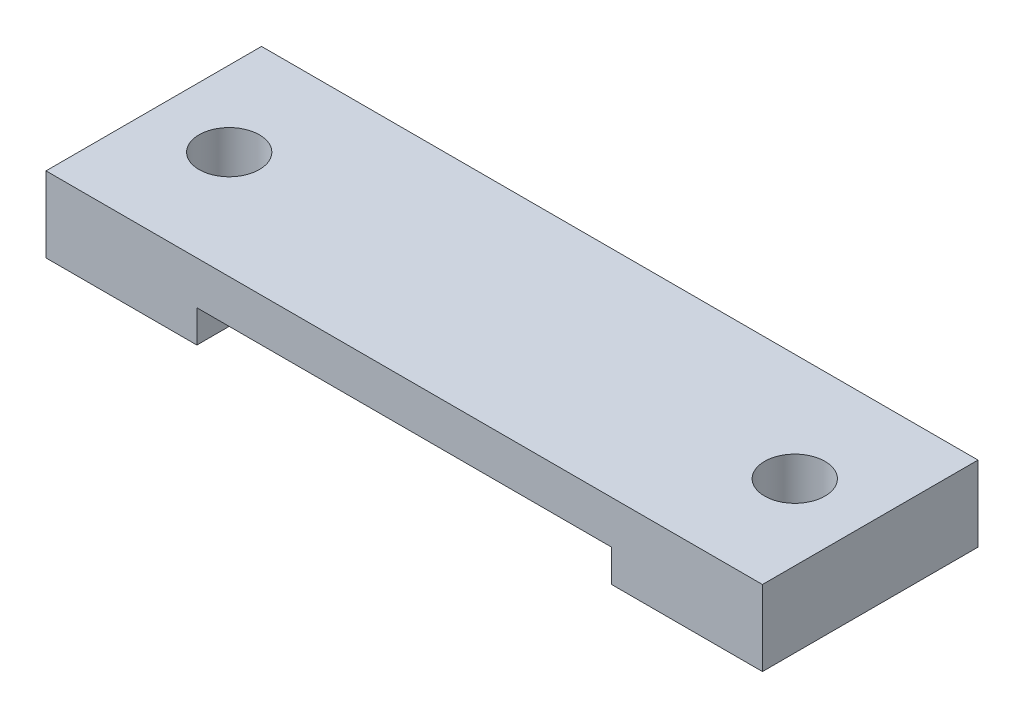
ISO-10303-21;
HEADER;
FILE_DESCRIPTION(('STEP AP214'),'2;1');
FILE_NAME('part.step','',(''),(''),'','','');
FILE_SCHEMA(('AUTOMOTIVE_DESIGN { 1 0 10303 214 1 1 1 1 }'));
ENDSEC;
DATA;
#1=APPLICATION_CONTEXT('core data for automotive mechanical design processes');
#2=APPLICATION_PROTOCOL_DEFINITION('international standard','automotive_design',2000,#1);
#3=PRODUCT_CONTEXT('',#1,'mechanical');
#4=PRODUCT('Part','Part','',(#3));
#5=PRODUCT_RELATED_PRODUCT_CATEGORY('part','',(#4));
#6=PRODUCT_DEFINITION_FORMATION('','',#4);
#7=PRODUCT_DEFINITION_CONTEXT('part definition',#1,'design');
#8=PRODUCT_DEFINITION('design','',#6,#7);
#9=PRODUCT_DEFINITION_SHAPE('','',#8);
#10=(LENGTH_UNIT() NAMED_UNIT(*) SI_UNIT(.MILLI.,.METRE.));
#11=(NAMED_UNIT(*) PLANE_ANGLE_UNIT() SI_UNIT($,.RADIAN.));
#12=(NAMED_UNIT(*) SI_UNIT($,.STERADIAN.) SOLID_ANGLE_UNIT());
#13=UNCERTAINTY_MEASURE_WITH_UNIT(LENGTH_MEASURE(1.E-05),#10,'distance_accuracy_value','');
#14=(GEOMETRIC_REPRESENTATION_CONTEXT(3) GLOBAL_UNCERTAINTY_ASSIGNED_CONTEXT((#13)) GLOBAL_UNIT_ASSIGNED_CONTEXT((#10,
#11,#12)) REPRESENTATION_CONTEXT('',''));
#15=CARTESIAN_POINT('',(0.,0.,0.));
#16=DIRECTION('',(0.,0.,1.));
#17=DIRECTION('',(1.,0.,0.));
#18=AXIS2_PLACEMENT_3D('',#15,#16,#17);
#19=CARTESIAN_POINT('',(0.,-3.5,-5.));
#20=DIRECTION('',(0.,0.,-1.));
#21=DIRECTION('',(-1.,0.,0.));
#22=AXIS2_PLACEMENT_3D('',#19,#20,#21);
#23=PLANE('',#22);
#24=DIRECTION('',(-1.,0.,0.));
#25=VECTOR('',#24,1.);
#26=CARTESIAN_POINT('',(0.,0.,-5.));
#27=LINE('',#26,#25);
#28=CARTESIAN_POINT('',(16.62,0.,-5.));
#29=VERTEX_POINT('',#28);
#30=CARTESIAN_POINT('',(-16.62,0.,-5.));
#31=VERTEX_POINT('',#30);
#32=EDGE_CURVE('E128',#29,#31,#27,.T.);
#33=ORIENTED_EDGE('',*,*,#32,.F.);
#34=DIRECTION('',(0.,1.,0.));
#35=VECTOR('',#34,1.);
#36=CARTESIAN_POINT('',(16.62,-3.5,-5.));
#37=LINE('',#36,#35);
#38=CARTESIAN_POINT('',(16.62,-3.5,-5.));
#39=VERTEX_POINT('',#38);
#40=EDGE_CURVE('E126',#39,#29,#37,.T.);
#41=ORIENTED_EDGE('',*,*,#40,.F.);
#42=DIRECTION('',(1.,0.,0.));
#43=VECTOR('',#42,1.);
#44=CARTESIAN_POINT('',(0.,-3.5,-5.));
#45=LINE('',#44,#43);
#46=CARTESIAN_POINT('',(9.62,-3.5,-5.));
#47=VERTEX_POINT('',#46);
#48=EDGE_CURVE('E112',#47,#39,#45,.T.);
#49=ORIENTED_EDGE('',*,*,#48,.F.);
#50=DIRECTION('',(0.,1.,0.));
#51=VECTOR('',#50,1.);
#52=CARTESIAN_POINT('',(9.62,-3.5,-5.));
#53=LINE('',#52,#51);
#54=CARTESIAN_POINT('',(9.62,-2.,-5.));
#55=VERTEX_POINT('',#54);
#56=EDGE_CURVE('E133',#47,#55,#53,.T.);
#57=ORIENTED_EDGE('',*,*,#56,.T.);
#58=DIRECTION('',(1.,0.,0.));
#59=VECTOR('',#58,1.);
#60=CARTESIAN_POINT('',(0.,-2.,-5.));
#61=LINE('',#60,#59);
#62=CARTESIAN_POINT('',(-9.62,-2.,-5.));
#63=VERTEX_POINT('',#62);
#64=EDGE_CURVE('E174',#63,#55,#61,.T.);
#65=ORIENTED_EDGE('',*,*,#64,.F.);
#66=DIRECTION('',(0.,1.,0.));
#67=VECTOR('',#66,1.);
#68=CARTESIAN_POINT('',(-9.62,-3.5,-5.));
#69=LINE('',#68,#67);
#70=CARTESIAN_POINT('',(-9.62,-3.5,-5.));
#71=VERTEX_POINT('',#70);
#72=EDGE_CURVE('E11',#71,#63,#69,.T.);
#73=ORIENTED_EDGE('',*,*,#72,.F.);
#74=DIRECTION('',(-1.,0.,0.));
#75=VECTOR('',#74,1.);
#76=CARTESIAN_POINT('',(0.,-3.5,-5.));
#77=LINE('',#76,#75);
#78=CARTESIAN_POINT('',(-16.62,-3.5,-5.));
#79=VERTEX_POINT('',#78);
#80=EDGE_CURVE('E184',#71,#79,#77,.T.);
#81=ORIENTED_EDGE('',*,*,#80,.T.);
#82=DIRECTION('',(0.,1.,0.));
#83=VECTOR('',#82,1.);
#84=CARTESIAN_POINT('',(-16.62,-3.5,-5.));
#85=LINE('',#84,#83);
#86=EDGE_CURVE('E43',#79,#31,#85,.T.);
#87=ORIENTED_EDGE('',*,*,#86,.T.);
#88=EDGE_LOOP('',(#33,#41,#49,#57,#65,#73,#81,#87));
#89=FACE_BOUND('',#88,.T.);
#90=ADVANCED_FACE('F39',(#89),#23,.T.);
#91=CARTESIAN_POINT('',(-9.62,-3.5,0.));
#92=DIRECTION('',(1.,0.,0.));
#93=DIRECTION('',(0.,0.,-1.));
#94=AXIS2_PLACEMENT_3D('',#91,#92,#93);
#95=PLANE('',#94);
#96=DIRECTION('',(0.,0.,-1.));
#97=VECTOR('',#96,1.);
#98=CARTESIAN_POINT('',(-9.62,-2.,0.));
#99=LINE('',#98,#97);
#100=CARTESIAN_POINT('',(-9.62,-2.,5.));
#101=VERTEX_POINT('',#100);
#102=EDGE_CURVE('E56',#101,#63,#99,.T.);
#103=ORIENTED_EDGE('',*,*,#102,.F.);
#104=DIRECTION('',(0.,1.,0.));
#105=VECTOR('',#104,1.);
#106=CARTESIAN_POINT('',(-9.62,-3.5,5.));
#107=LINE('',#106,#105);
#108=CARTESIAN_POINT('',(-9.62,-3.5,5.));
#109=VERTEX_POINT('',#108);
#110=EDGE_CURVE('E49',#109,#101,#107,.T.);
#111=ORIENTED_EDGE('',*,*,#110,.F.);
#112=DIRECTION('',(0.,0.,-1.));
#113=VECTOR('',#112,1.);
#114=CARTESIAN_POINT('',(-9.62,-3.5,0.));
#115=LINE('',#114,#113);
#116=EDGE_CURVE('E194',#109,#71,#115,.T.);
#117=ORIENTED_EDGE('',*,*,#116,.T.);
#118=ORIENTED_EDGE('',*,*,#72,.T.);
#119=EDGE_LOOP('',(#103,#111,#117,#118));
#120=FACE_BOUND('',#119,.T.);
#121=ADVANCED_FACE('F236',(#120),#95,.T.);
#122=CARTESIAN_POINT('',(0.,-3.5,5.));
#123=DIRECTION('',(0.,0.,-1.));
#124=DIRECTION('',(-1.,0.,0.));
#125=AXIS2_PLACEMENT_3D('',#122,#123,#124);
#126=PLANE('',#125);
#127=DIRECTION('',(-1.,0.,0.));
#128=VECTOR('',#127,1.);
#129=CARTESIAN_POINT('',(0.,0.,5.));
#130=LINE('',#129,#128);
#131=CARTESIAN_POINT('',(16.62,0.,5.));
#132=VERTEX_POINT('',#131);
#133=CARTESIAN_POINT('',(-16.62,0.,5.));
#134=VERTEX_POINT('',#133);
#135=EDGE_CURVE('E185',#132,#134,#130,.T.);
#136=ORIENTED_EDGE('',*,*,#135,.T.);
#137=DIRECTION('',(0.,1.,0.));
#138=VECTOR('',#137,1.);
#139=CARTESIAN_POINT('',(-16.62,-3.5,5.));
#140=LINE('',#139,#138);
#141=CARTESIAN_POINT('',(-16.62,-3.5,5.));
#142=VERTEX_POINT('',#141);
#143=EDGE_CURVE('E79',#142,#134,#140,.T.);
#144=ORIENTED_EDGE('',*,*,#143,.F.);
#145=DIRECTION('',(-1.,0.,0.));
#146=VECTOR('',#145,1.);
#147=CARTESIAN_POINT('',(0.,-3.5,5.));
#148=LINE('',#147,#146);
#149=EDGE_CURVE('E191',#109,#142,#148,.T.);
#150=ORIENTED_EDGE('',*,*,#149,.F.);
#151=ORIENTED_EDGE('',*,*,#110,.T.);
#152=DIRECTION('',(1.,0.,0.));
#153=VECTOR('',#152,1.);
#154=CARTESIAN_POINT('',(0.,-2.,5.));
#155=LINE('',#154,#153);
#156=CARTESIAN_POINT('',(9.62,-2.,5.));
#157=VERTEX_POINT('',#156);
#158=EDGE_CURVE('E160',#101,#157,#155,.T.);
#159=ORIENTED_EDGE('',*,*,#158,.T.);
#160=DIRECTION('',(0.,1.,0.));
#161=VECTOR('',#160,1.);
#162=CARTESIAN_POINT('',(9.62,-3.5,5.));
#163=LINE('',#162,#161);
#164=CARTESIAN_POINT('',(9.62,-3.5,5.));
#165=VERTEX_POINT('',#164);
#166=EDGE_CURVE('E161',#165,#157,#163,.T.);
#167=ORIENTED_EDGE('',*,*,#166,.F.);
#168=DIRECTION('',(1.,0.,0.));
#169=VECTOR('',#168,1.);
#170=CARTESIAN_POINT('',(0.,-3.5,5.));
#171=LINE('',#170,#169);
#172=CARTESIAN_POINT('',(16.62,-3.5,5.));
#173=VERTEX_POINT('',#172);
#174=EDGE_CURVE('E134',#165,#173,#171,.T.);
#175=ORIENTED_EDGE('',*,*,#174,.T.);
#176=DIRECTION('',(0.,1.,0.));
#177=VECTOR('',#176,1.);
#178=CARTESIAN_POINT('',(16.62,-3.5,5.));
#179=LINE('',#178,#177);
#180=EDGE_CURVE('E138',#173,#132,#179,.T.);
#181=ORIENTED_EDGE('',*,*,#180,.T.);
#182=EDGE_LOOP('',(#136,#144,#150,#151,#159,#167,#175,#181));
#183=FACE_BOUND('',#182,.T.);
#184=ADVANCED_FACE('F217',(#183),#126,.F.);
#185=CARTESIAN_POINT('',(-13.12,-3.5,0.));
#186=DIRECTION('',(0.,1.,0.));
#187=DIRECTION('',(0.,0.,1.));
#188=AXIS2_PLACEMENT_3D('',#185,#186,#187);
#189=CYLINDRICAL_SURFACE('',#188,1.4);
#190=CARTESIAN_POINT('',(-13.12,-3.5,0.));
#191=DIRECTION('',(0.,1.,0.));
#192=DIRECTION('',(0.,0.,1.));
#193=AXIS2_PLACEMENT_3D('',#190,#191,#192);
#194=CIRCLE('',#193,1.4);
#195=CARTESIAN_POINT('',(-13.12,-3.5,1.4));
#196=VERTEX_POINT('',#195);
#197=EDGE_CURVE('E180',#196,#196,#194,.T.);
#198=ORIENTED_EDGE('',*,*,#197,.F.);
#199=EDGE_LOOP('',(#198));
#200=FACE_BOUND('',#199,.T.);
#201=CARTESIAN_POINT('',(-13.12,0.,0.));
#202=DIRECTION('',(0.,1.,0.));
#203=DIRECTION('',(0.,0.,1.));
#204=AXIS2_PLACEMENT_3D('',#201,#202,#203);
#205=CIRCLE('',#204,1.4);
#206=CARTESIAN_POINT('',(-13.12,0.,1.4));
#207=VERTEX_POINT('',#206);
#208=EDGE_CURVE('E179',#207,#207,#205,.T.);
#209=ORIENTED_EDGE('',*,*,#208,.T.);
#210=EDGE_LOOP('',(#209));
#211=FACE_BOUND('',#210,.T.);
#212=ADVANCED_FACE('F41',(#200,#211),#189,.F.);
#213=CARTESIAN_POINT('',(-16.62,-3.5,0.));
#214=DIRECTION('',(-1.,0.,0.));
#215=DIRECTION('',(0.,0.,1.));
#216=AXIS2_PLACEMENT_3D('',#213,#214,#215);
#217=PLANE('',#216);
#218=DIRECTION('',(0.,0.,1.));
#219=VECTOR('',#218,1.);
#220=CARTESIAN_POINT('',(-16.62,0.,0.));
#221=LINE('',#220,#219);
#222=EDGE_CURVE('E203',#31,#134,#221,.T.);
#223=ORIENTED_EDGE('',*,*,#222,.F.);
#224=ORIENTED_EDGE('',*,*,#86,.F.);
#225=DIRECTION('',(0.,0.,1.));
#226=VECTOR('',#225,1.);
#227=CARTESIAN_POINT('',(-16.62,-3.5,0.));
#228=LINE('',#227,#226);
#229=EDGE_CURVE('E188',#79,#142,#228,.T.);
#230=ORIENTED_EDGE('',*,*,#229,.T.);
#231=ORIENTED_EDGE('',*,*,#143,.T.);
#232=EDGE_LOOP('',(#223,#224,#230,#231));
#233=FACE_BOUND('',#232,.T.);
#234=ADVANCED_FACE('F212',(#233),#217,.T.);
#235=CARTESIAN_POINT('',(0.,-3.5,0.));
#236=DIRECTION('',(0.,1.,0.));
#237=DIRECTION('',(0.,0.,1.));
#238=AXIS2_PLACEMENT_3D('',#235,#236,#237);
#239=PLANE('',#238);
#240=ORIENTED_EDGE('',*,*,#197,.T.);
#241=EDGE_LOOP('',(#240));
#242=FACE_BOUND('',#241,.T.);
#243=ORIENTED_EDGE('',*,*,#80,.F.);
#244=ORIENTED_EDGE('',*,*,#116,.F.);
#245=ORIENTED_EDGE('',*,*,#149,.T.);
#246=ORIENTED_EDGE('',*,*,#229,.F.);
#247=EDGE_LOOP('',(#243,#244,#245,#246));
#248=FACE_BOUND('',#247,.T.);
#249=ADVANCED_FACE('F230',(#242,#248),#239,.F.);
#250=CARTESIAN_POINT('',(0.,0.,0.));
#251=DIRECTION('',(0.,1.,0.));
#252=DIRECTION('',(0.,0.,1.));
#253=AXIS2_PLACEMENT_3D('',#250,#251,#252);
#254=PLANE('',#253);
#255=ORIENTED_EDGE('',*,*,#208,.F.);
#256=EDGE_LOOP('',(#255));
#257=FACE_BOUND('',#256,.T.);
#258=ORIENTED_EDGE('',*,*,#32,.T.);
#259=ORIENTED_EDGE('',*,*,#222,.T.);
#260=ORIENTED_EDGE('',*,*,#135,.F.);
#261=DIRECTION('',(0.,0.,1.));
#262=VECTOR('',#261,1.);
#263=CARTESIAN_POINT('',(16.62,0.,0.));
#264=LINE('',#263,#262);
#265=EDGE_CURVE('E145',#29,#132,#264,.T.);
#266=ORIENTED_EDGE('',*,*,#265,.F.);
#267=EDGE_LOOP('',(#258,#259,#260,#266));
#268=FACE_BOUND('',#267,.T.);
#269=CARTESIAN_POINT('',(13.12,0.,0.));
#270=DIRECTION('',(0.,1.,0.));
#271=DIRECTION('',(0.,0.,1.));
#272=AXIS2_PLACEMENT_3D('',#269,#270,#271);
#273=CIRCLE('',#272,1.4);
#274=CARTESIAN_POINT('',(13.12,0.,1.4));
#275=VERTEX_POINT('',#274);
#276=EDGE_CURVE('E152',#275,#275,#273,.T.);
#277=ORIENTED_EDGE('',*,*,#276,.F.);
#278=EDGE_LOOP('',(#277));
#279=FACE_BOUND('',#278,.T.);
#280=ADVANCED_FACE('F214',(#257,#268,#279),#254,.T.);
#281=CARTESIAN_POINT('',(0.,-2.,0.));
#282=DIRECTION('',(0.,1.,0.));
#283=DIRECTION('',(0.,0.,1.));
#284=AXIS2_PLACEMENT_3D('',#281,#282,#283);
#285=PLANE('',#284);
#286=ORIENTED_EDGE('',*,*,#158,.F.);
#287=ORIENTED_EDGE('',*,*,#102,.T.);
#288=ORIENTED_EDGE('',*,*,#64,.T.);
#289=DIRECTION('',(0.,0.,-1.));
#290=VECTOR('',#289,1.);
#291=CARTESIAN_POINT('',(9.62,-2.,0.));
#292=LINE('',#291,#290);
#293=EDGE_CURVE('E170',#157,#55,#292,.T.);
#294=ORIENTED_EDGE('',*,*,#293,.F.);
#295=EDGE_LOOP('',(#286,#287,#288,#294));
#296=FACE_BOUND('',#295,.T.);
#297=ADVANCED_FACE('F222',(#296),#285,.F.);
#298=CARTESIAN_POINT('',(9.62,-3.5,0.));
#299=DIRECTION('',(1.,0.,0.));
#300=DIRECTION('',(0.,0.,-1.));
#301=AXIS2_PLACEMENT_3D('',#298,#299,#300);
#302=PLANE('',#301);
#303=ORIENTED_EDGE('',*,*,#166,.T.);
#304=ORIENTED_EDGE('',*,*,#293,.T.);
#305=ORIENTED_EDGE('',*,*,#56,.F.);
#306=DIRECTION('',(0.,0.,-1.));
#307=VECTOR('',#306,1.);
#308=CARTESIAN_POINT('',(9.62,-3.5,0.));
#309=LINE('',#308,#307);
#310=EDGE_CURVE('E120',#165,#47,#309,.T.);
#311=ORIENTED_EDGE('',*,*,#310,.F.);
#312=EDGE_LOOP('',(#303,#304,#305,#311));
#313=FACE_BOUND('',#312,.T.);
#314=ADVANCED_FACE('F220',(#313),#302,.F.);
#315=CARTESIAN_POINT('',(16.62,-3.5,0.));
#316=DIRECTION('',(-1.,0.,0.));
#317=DIRECTION('',(0.,0.,1.));
#318=AXIS2_PLACEMENT_3D('',#315,#316,#317);
#319=PLANE('',#318);
#320=ORIENTED_EDGE('',*,*,#265,.T.);
#321=ORIENTED_EDGE('',*,*,#180,.F.);
#322=DIRECTION('',(0.,0.,1.));
#323=VECTOR('',#322,1.);
#324=CARTESIAN_POINT('',(16.62,-3.5,0.));
#325=LINE('',#324,#323);
#326=EDGE_CURVE('E117',#39,#173,#325,.T.);
#327=ORIENTED_EDGE('',*,*,#326,.F.);
#328=ORIENTED_EDGE('',*,*,#40,.T.);
#329=EDGE_LOOP('',(#320,#321,#327,#328));
#330=FACE_BOUND('',#329,.T.);
#331=ADVANCED_FACE('F136',(#330),#319,.F.);
#332=CARTESIAN_POINT('',(13.12,-3.5,0.));
#333=DIRECTION('',(0.,1.,0.));
#334=DIRECTION('',(0.,0.,1.));
#335=AXIS2_PLACEMENT_3D('',#332,#333,#334);
#336=CYLINDRICAL_SURFACE('',#335,1.4);
#337=CARTESIAN_POINT('',(13.12,-3.5,0.));
#338=DIRECTION('',(0.,1.,0.));
#339=DIRECTION('',(0.,0.,1.));
#340=AXIS2_PLACEMENT_3D('',#337,#338,#339);
#341=CIRCLE('',#340,1.4);
#342=CARTESIAN_POINT('',(13.12,-3.5,1.4));
#343=VERTEX_POINT('',#342);
#344=EDGE_CURVE('E141',#343,#343,#341,.T.);
#345=ORIENTED_EDGE('',*,*,#344,.F.);
#346=EDGE_LOOP('',(#345));
#347=FACE_BOUND('',#346,.T.);
#348=ORIENTED_EDGE('',*,*,#276,.T.);
#349=EDGE_LOOP('',(#348));
#350=FACE_BOUND('',#349,.T.);
#351=ADVANCED_FACE('F315',(#347,#350),#336,.F.);
#352=CARTESIAN_POINT('',(0.,-3.5,0.));
#353=DIRECTION('',(0.,1.,0.));
#354=DIRECTION('',(0.,0.,1.));
#355=AXIS2_PLACEMENT_3D('',#352,#353,#354);
#356=PLANE('',#355);
#357=ORIENTED_EDGE('',*,*,#344,.T.);
#358=EDGE_LOOP('',(#357));
#359=FACE_BOUND('',#358,.T.);
#360=ORIENTED_EDGE('',*,*,#326,.T.);
#361=ORIENTED_EDGE('',*,*,#174,.F.);
#362=ORIENTED_EDGE('',*,*,#310,.T.);
#363=ORIENTED_EDGE('',*,*,#48,.T.);
#364=EDGE_LOOP('',(#360,#361,#362,#363));
#365=FACE_BOUND('',#364,.T.);
#366=ADVANCED_FACE('F114',(#359,#365),#356,.F.);
#367=CLOSED_SHELL('',(#90,#121,#184,#212,#234,#249,#280,#297,#314,#331,#351,#366));
#368=MANIFOLD_SOLID_BREP('B2',#367);
#369=ADVANCED_BREP_SHAPE_REPRESENTATION('',(#18,#368),#14);
#370=SHAPE_DEFINITION_REPRESENTATION(#9,#369);
ENDSEC;
END-ISO-10303-21;
